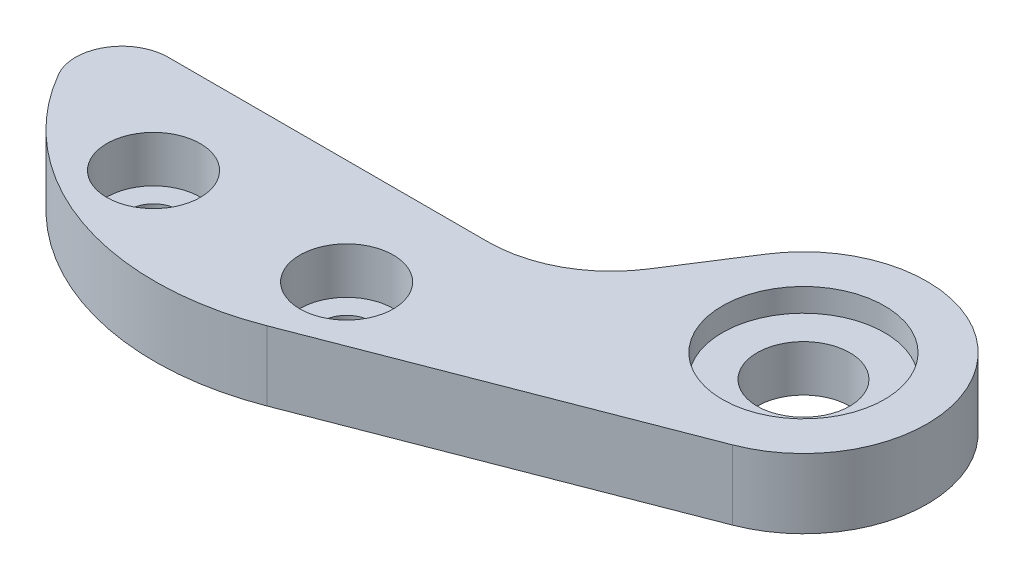
ISO-10303-21;
HEADER;
FILE_DESCRIPTION(('STEP AP214'),'2;1');
FILE_NAME('part.step','',(''),(''),'','','');
FILE_SCHEMA(('AUTOMOTIVE_DESIGN { 1 0 10303 214 1 1 1 1 }'));
ENDSEC;
DATA;
#1=APPLICATION_CONTEXT('core data for automotive mechanical design processes');
#2=APPLICATION_PROTOCOL_DEFINITION('international standard','automotive_design',2000,#1);
#3=PRODUCT_CONTEXT('',#1,'mechanical');
#4=PRODUCT('Part','Part','',(#3));
#5=PRODUCT_RELATED_PRODUCT_CATEGORY('part','',(#4));
#6=PRODUCT_DEFINITION_FORMATION('','',#4);
#7=PRODUCT_DEFINITION_CONTEXT('part definition',#1,'design');
#8=PRODUCT_DEFINITION('design','',#6,#7);
#9=PRODUCT_DEFINITION_SHAPE('','',#8);
#10=(LENGTH_UNIT() NAMED_UNIT(*) SI_UNIT(.MILLI.,.METRE.));
#11=(NAMED_UNIT(*) PLANE_ANGLE_UNIT() SI_UNIT($,.RADIAN.));
#12=(NAMED_UNIT(*) SI_UNIT($,.STERADIAN.) SOLID_ANGLE_UNIT());
#13=UNCERTAINTY_MEASURE_WITH_UNIT(LENGTH_MEASURE(1.E-05),#10,'distance_accuracy_value','');
#14=(GEOMETRIC_REPRESENTATION_CONTEXT(3) GLOBAL_UNCERTAINTY_ASSIGNED_CONTEXT((#13)) GLOBAL_UNIT_ASSIGNED_CONTEXT((#10,
#11,#12)) REPRESENTATION_CONTEXT('',''));
#15=CARTESIAN_POINT('',(0.,0.,0.));
#16=DIRECTION('',(0.,0.,1.));
#17=DIRECTION('',(1.,0.,0.));
#18=AXIS2_PLACEMENT_3D('',#15,#16,#17);
#19=CARTESIAN_POINT('',(0.,4.5,0.));
#20=DIRECTION('',(0.,-1.,0.));
#21=DIRECTION('',(0.,0.,-1.));
#22=AXIS2_PLACEMENT_3D('',#19,#20,#21);
#23=CYLINDRICAL_SURFACE('',#22,17.);
#24=CARTESIAN_POINT('',(0.,0.,0.));
#25=DIRECTION('',(0.,-1.,0.));
#26=DIRECTION('',(0.,0.,-1.));
#27=AXIS2_PLACEMENT_3D('',#24,#25,#26);
#28=CIRCLE('',#27,17.);
#29=CARTESIAN_POINT('',(6.12,0.,15.8601891539792));
#30=VERTEX_POINT('',#29);
#31=CARTESIAN_POINT('',(-14.7224318643355,0.,8.5));
#32=VERTEX_POINT('',#31);
#33=EDGE_CURVE('E134',#30,#32,#28,.T.);
#34=ORIENTED_EDGE('',*,*,#33,.F.);
#35=DIRECTION('',(0.,-1.,0.));
#36=VECTOR('',#35,1.);
#37=CARTESIAN_POINT('',(6.12,4.5,15.8601891539792));
#38=LINE('',#37,#36);
#39=CARTESIAN_POINT('',(6.12,4.5,15.8601891539792));
#40=VERTEX_POINT('',#39);
#41=EDGE_CURVE('E117',#40,#30,#38,.T.);
#42=ORIENTED_EDGE('',*,*,#41,.F.);
#43=CARTESIAN_POINT('',(0.,4.5,0.));
#44=DIRECTION('',(0.,-1.,0.));
#45=DIRECTION('',(0.,0.,-1.));
#46=AXIS2_PLACEMENT_3D('',#43,#44,#45);
#47=CIRCLE('',#46,17.);
#48=CARTESIAN_POINT('',(-14.7224318643355,4.5,8.5));
#49=VERTEX_POINT('',#48);
#50=EDGE_CURVE('E112',#40,#49,#47,.T.);
#51=ORIENTED_EDGE('',*,*,#50,.T.);
#52=DIRECTION('',(0.,-1.,0.));
#53=VECTOR('',#52,1.);
#54=CARTESIAN_POINT('',(-14.7224318643355,4.5,8.5));
#55=LINE('',#54,#53);
#56=EDGE_CURVE('E94',#49,#32,#55,.T.);
#57=ORIENTED_EDGE('',*,*,#56,.T.);
#58=EDGE_LOOP('',(#34,#42,#51,#57));
#59=FACE_BOUND('',#58,.T.);
#60=ADVANCED_FACE('F37',(#59),#23,.T.);
#61=CARTESIAN_POINT('',(27.88,4.5,7.46361842540199));
#62=DIRECTION('',(0.359999999999999,0.,0.932952303175248));
#63=DIRECTION('',(0.932952303175248,0.,-0.359999999999999));
#64=AXIS2_PLACEMENT_3D('',#61,#62,#63);
#65=PLANE('',#64);
#66=DIRECTION('',(-0.932952303175248,0.,0.359999999999999));
#67=VECTOR('',#66,1.);
#68=CARTESIAN_POINT('',(27.88,0.,7.46361842540199));
#69=LINE('',#68,#67);
#70=CARTESIAN_POINT('',(27.88,0.,7.46361842540199));
#71=VERTEX_POINT('',#70);
#72=EDGE_CURVE('E118',#71,#30,#69,.T.);
#73=ORIENTED_EDGE('',*,*,#72,.F.);
#74=DIRECTION('',(0.,-1.,0.));
#75=VECTOR('',#74,1.);
#76=CARTESIAN_POINT('',(27.88,4.5,7.46361842540199));
#77=LINE('',#76,#75);
#78=CARTESIAN_POINT('',(27.88,4.5,7.46361842540199));
#79=VERTEX_POINT('',#78);
#80=EDGE_CURVE('E145',#79,#71,#77,.T.);
#81=ORIENTED_EDGE('',*,*,#80,.F.);
#82=DIRECTION('',(-0.932952303175248,0.,0.359999999999999));
#83=VECTOR('',#82,1.);
#84=CARTESIAN_POINT('',(27.88,4.5,7.46361842540199));
#85=LINE('',#84,#83);
#86=EDGE_CURVE('E105',#79,#40,#85,.T.);
#87=ORIENTED_EDGE('',*,*,#86,.T.);
#88=ORIENTED_EDGE('',*,*,#41,.T.);
#89=EDGE_LOOP('',(#73,#81,#87,#88));
#90=FACE_BOUND('',#89,.T.);
#91=ADVANCED_FACE('F163',(#90),#65,.T.);
#92=CARTESIAN_POINT('',(25.,4.5,0.));
#93=DIRECTION('',(0.,-1.,0.));
#94=DIRECTION('',(0.,0.,-1.));
#95=AXIS2_PLACEMENT_3D('',#92,#93,#94);
#96=CYLINDRICAL_SURFACE('',#95,8.00000000000001);
#97=CARTESIAN_POINT('',(25.,0.,0.));
#98=DIRECTION('',(0.,-1.,0.));
#99=DIRECTION('',(0.,0.,-1.));
#100=AXIS2_PLACEMENT_3D('',#97,#98,#99);
#101=CIRCLE('',#100,8.00000000000001);
#102=CARTESIAN_POINT('',(18.2638318794235,0.,-4.31555779144817));
#103=VERTEX_POINT('',#102);
#104=EDGE_CURVE('E121',#103,#71,#101,.T.);
#105=ORIENTED_EDGE('',*,*,#104,.F.);
#106=DIRECTION('',(0.,-1.,0.));
#107=VECTOR('',#106,1.);
#108=CARTESIAN_POINT('',(18.2638318794235,4.5,-4.31555779144817));
#109=LINE('',#108,#107);
#110=CARTESIAN_POINT('',(18.2638318794235,4.5,-4.31555779144817));
#111=VERTEX_POINT('',#110);
#112=EDGE_CURVE('E147',#111,#103,#109,.T.);
#113=ORIENTED_EDGE('',*,*,#112,.F.);
#114=CARTESIAN_POINT('',(25.,4.5,0.));
#115=DIRECTION('',(0.,-1.,0.));
#116=DIRECTION('',(0.,0.,-1.));
#117=AXIS2_PLACEMENT_3D('',#114,#115,#116);
#118=CIRCLE('',#117,8.00000000000001);
#119=EDGE_CURVE('E130',#111,#79,#118,.T.);
#120=ORIENTED_EDGE('',*,*,#119,.T.);
#121=ORIENTED_EDGE('',*,*,#80,.T.);
#122=EDGE_LOOP('',(#105,#113,#120,#121));
#123=FACE_BOUND('',#122,.T.);
#124=ADVANCED_FACE('F167',(#123),#96,.T.);
#125=CARTESIAN_POINT('',(12.9364306663359,4.5,4.));
#126=DIRECTION('',(-0.842021015072063,0.,-0.539444723931019));
#127=DIRECTION('',(-0.539444723931019,0.,0.842021015072063));
#128=AXIS2_PLACEMENT_3D('',#125,#126,#127);
#129=PLANE('',#128);
#130=DIRECTION('',(0.539444723931019,0.,-0.842021015072062));
#131=VECTOR('',#130,1.);
#132=CARTESIAN_POINT('',(12.9364306663359,0.,4.));
#133=LINE('',#132,#131);
#134=CARTESIAN_POINT('',(15.2968858978029,0.,0.315557791448156));
#135=VERTEX_POINT('',#134);
#136=EDGE_CURVE('E139',#135,#103,#133,.T.);
#137=ORIENTED_EDGE('',*,*,#136,.F.);
#138=DIRECTION('',(0.,-1.,0.));
#139=VECTOR('',#138,1.);
#140=CARTESIAN_POINT('',(15.2968858978029,4.5,0.315557791448155));
#141=LINE('',#140,#139);
#142=CARTESIAN_POINT('',(15.2968858978029,4.5,0.315557791448156));
#143=VERTEX_POINT('',#142);
#144=EDGE_CURVE('E52',#135,#143,#141,.F.);
#145=ORIENTED_EDGE('',*,*,#144,.T.);
#146=DIRECTION('',(0.539444723931019,0.,-0.842021015072062));
#147=VECTOR('',#146,1.);
#148=CARTESIAN_POINT('',(12.9364306663359,4.5,4.));
#149=LINE('',#148,#147);
#150=EDGE_CURVE('E128',#143,#111,#149,.T.);
#151=ORIENTED_EDGE('',*,*,#150,.T.);
#152=ORIENTED_EDGE('',*,*,#112,.T.);
#153=EDGE_LOOP('',(#137,#145,#151,#152));
#154=FACE_BOUND('',#153,.T.);
#155=ADVANCED_FACE('F168',(#154),#129,.T.);
#156=CARTESIAN_POINT('',(-12.1243556529821,4.5,4.));
#157=DIRECTION('',(0.,0.,-1.));
#158=DIRECTION('',(-1.,0.,0.));
#159=AXIS2_PLACEMENT_3D('',#156,#157,#158);
#160=PLANE('',#159);
#161=DIRECTION('',(1.,0.,0.));
#162=VECTOR('',#161,1.);
#163=CARTESIAN_POINT('',(-12.1243556529821,4.5,4.));
#164=LINE('',#163,#162);
#165=CARTESIAN_POINT('',(-12.1243556529821,4.5,4.));
#166=VERTEX_POINT('',#165);
#167=CARTESIAN_POINT('',(8.56071777722641,4.5,4.));
#168=VERTEX_POINT('',#167);
#169=EDGE_CURVE('E115',#166,#168,#164,.T.);
#170=ORIENTED_EDGE('',*,*,#169,.T.);
#171=DIRECTION('',(0.,-1.,0.));
#172=VECTOR('',#171,1.);
#173=CARTESIAN_POINT('',(8.56071777722641,0.,4.));
#174=LINE('',#173,#172);
#175=CARTESIAN_POINT('',(8.56071777722641,0.,4.));
#176=VERTEX_POINT('',#175);
#177=EDGE_CURVE('E144',#168,#176,#174,.T.);
#178=ORIENTED_EDGE('',*,*,#177,.T.);
#179=DIRECTION('',(1.,0.,0.));
#180=VECTOR('',#179,1.);
#181=CARTESIAN_POINT('',(-12.1243556529821,0.,4.));
#182=LINE('',#181,#180);
#183=CARTESIAN_POINT('',(-12.1243556529821,0.,4.));
#184=VERTEX_POINT('',#183);
#185=EDGE_CURVE('E137',#184,#176,#182,.T.);
#186=ORIENTED_EDGE('',*,*,#185,.F.);
#187=DIRECTION('',(0.,-1.,0.));
#188=VECTOR('',#187,1.);
#189=CARTESIAN_POINT('',(-12.1243556529821,4.5,4.));
#190=LINE('',#189,#188);
#191=EDGE_CURVE('E104',#166,#184,#190,.T.);
#192=ORIENTED_EDGE('',*,*,#191,.F.);
#193=EDGE_LOOP('',(#170,#178,#186,#192));
#194=FACE_BOUND('',#193,.T.);
#195=ADVANCED_FACE('F156',(#194),#160,.T.);
#196=CARTESIAN_POINT('',(-12.1243556529821,4.5,7.));
#197=DIRECTION('',(0.,-1.,0.));
#198=DIRECTION('',(0.,0.,-1.));
#199=AXIS2_PLACEMENT_3D('',#196,#197,#198);
#200=CYLINDRICAL_SURFACE('',#199,3.);
#201=CARTESIAN_POINT('',(-12.1243556529821,0.,7.));
#202=DIRECTION('',(0.,-1.,0.));
#203=DIRECTION('',(0.,0.,-1.));
#204=AXIS2_PLACEMENT_3D('',#201,#202,#203);
#205=CIRCLE('',#204,3.);
#206=EDGE_CURVE('E99',#32,#184,#205,.T.);
#207=ORIENTED_EDGE('',*,*,#206,.F.);
#208=ORIENTED_EDGE('',*,*,#56,.F.);
#209=CARTESIAN_POINT('',(-12.1243556529821,4.5,7.));
#210=DIRECTION('',(0.,-1.,0.));
#211=DIRECTION('',(0.,0.,-1.));
#212=AXIS2_PLACEMENT_3D('',#209,#210,#211);
#213=CIRCLE('',#212,3.);
#214=EDGE_CURVE('E97',#49,#166,#213,.T.);
#215=ORIENTED_EDGE('',*,*,#214,.T.);
#216=ORIENTED_EDGE('',*,*,#191,.T.);
#217=EDGE_LOOP('',(#207,#208,#215,#216));
#218=FACE_BOUND('',#217,.T.);
#219=ADVANCED_FACE('F96',(#218),#200,.T.);
#220=CARTESIAN_POINT('',(0.,4.5,0.));
#221=DIRECTION('',(0.,-1.,0.));
#222=DIRECTION('',(0.,0.,-1.));
#223=AXIS2_PLACEMENT_3D('',#220,#221,#222);
#224=PLANE('',#223);
#225=CARTESIAN_POINT('',(25.,4.5,0.));
#226=DIRECTION('',(0.,1.,0.));
#227=DIRECTION('',(0.,0.,1.));
#228=AXIS2_PLACEMENT_3D('',#225,#226,#227);
#229=CIRCLE('',#228,5.25000000000001);
#230=CARTESIAN_POINT('',(25.,4.5,5.25000000000001));
#231=VERTEX_POINT('',#230);
#232=EDGE_CURVE('E236',#231,#231,#229,.T.);
#233=ORIENTED_EDGE('',*,*,#232,.F.);
#234=EDGE_LOOP('',(#233));
#235=FACE_BOUND('',#234,.T.);
#236=CARTESIAN_POINT('',(-6.25,4.5,10.8253175473055));
#237=DIRECTION('',(0.,1.,0.));
#238=DIRECTION('',(0.,0.,1.));
#239=AXIS2_PLACEMENT_3D('',#236,#237,#238);
#240=CIRCLE('',#239,3.025);
#241=CARTESIAN_POINT('',(-6.25,4.5,13.8503175473055));
#242=VERTEX_POINT('',#241);
#243=EDGE_CURVE('E245',#242,#242,#240,.T.);
#244=ORIENTED_EDGE('',*,*,#243,.F.);
#245=EDGE_LOOP('',(#244));
#246=FACE_BOUND('',#245,.T.);
#247=CARTESIAN_POINT('',(6.25,4.5,10.8253175473055));
#248=DIRECTION('',(0.,1.,0.));
#249=DIRECTION('',(0.,0.,1.));
#250=AXIS2_PLACEMENT_3D('',#247,#248,#249);
#251=CIRCLE('',#250,3.025);
#252=CARTESIAN_POINT('',(6.25,4.5,13.8503175473055));
#253=VERTEX_POINT('',#252);
#254=EDGE_CURVE('E257',#253,#253,#251,.T.);
#255=ORIENTED_EDGE('',*,*,#254,.F.);
#256=EDGE_LOOP('',(#255));
#257=FACE_BOUND('',#256,.T.);
#258=ORIENTED_EDGE('',*,*,#50,.F.);
#259=ORIENTED_EDGE('',*,*,#86,.F.);
#260=ORIENTED_EDGE('',*,*,#119,.F.);
#261=ORIENTED_EDGE('',*,*,#150,.F.);
#262=CARTESIAN_POINT('',(8.56071777722641,4.5,-4.));
#263=DIRECTION('',(0.,-1.,0.));
#264=DIRECTION('',(0.,0.,-1.));
#265=AXIS2_PLACEMENT_3D('',#262,#263,#264);
#266=CIRCLE('',#265,8.);
#267=EDGE_CURVE('E11',#143,#168,#266,.T.);
#268=ORIENTED_EDGE('',*,*,#267,.T.);
#269=ORIENTED_EDGE('',*,*,#169,.F.);
#270=ORIENTED_EDGE('',*,*,#214,.F.);
#271=EDGE_LOOP('',(#258,#259,#260,#261,#268,#269,#270));
#272=FACE_BOUND('',#271,.T.);
#273=ADVANCED_FACE('F110',(#235,#246,#257,#272),#224,.F.);
#274=CARTESIAN_POINT('',(0.,0.,0.));
#275=DIRECTION('',(0.,-1.,0.));
#276=DIRECTION('',(0.,0.,-1.));
#277=AXIS2_PLACEMENT_3D('',#274,#275,#276);
#278=PLANE('',#277);
#279=CARTESIAN_POINT('',(25.,0.,0.));
#280=DIRECTION('',(0.,1.,0.));
#281=DIRECTION('',(0.,0.,1.));
#282=AXIS2_PLACEMENT_3D('',#279,#280,#281);
#283=CIRCLE('',#282,3.00000000000001);
#284=CARTESIAN_POINT('',(25.,0.,3.00000000000001));
#285=VERTEX_POINT('',#284);
#286=EDGE_CURVE('E238',#285,#285,#283,.T.);
#287=ORIENTED_EDGE('',*,*,#286,.T.);
#288=EDGE_LOOP('',(#287));
#289=FACE_BOUND('',#288,.T.);
#290=CARTESIAN_POINT('',(-6.25,0.,10.8253175473055));
#291=DIRECTION('',(0.,1.,0.));
#292=DIRECTION('',(0.,0.,1.));
#293=AXIS2_PLACEMENT_3D('',#290,#291,#292);
#294=CIRCLE('',#293,1.60000000000001);
#295=CARTESIAN_POINT('',(-6.25,0.,12.4253175473055));
#296=VERTEX_POINT('',#295);
#297=EDGE_CURVE('E254',#296,#296,#294,.T.);
#298=ORIENTED_EDGE('',*,*,#297,.T.);
#299=EDGE_LOOP('',(#298));
#300=FACE_BOUND('',#299,.T.);
#301=CARTESIAN_POINT('',(6.25,0.,10.8253175473055));
#302=DIRECTION('',(0.,1.,0.));
#303=DIRECTION('',(0.,0.,1.));
#304=AXIS2_PLACEMENT_3D('',#301,#302,#303);
#305=CIRCLE('',#304,1.60000000000001);
#306=CARTESIAN_POINT('',(6.25,0.,12.4253175473055));
#307=VERTEX_POINT('',#306);
#308=EDGE_CURVE('E124',#307,#307,#305,.T.);
#309=ORIENTED_EDGE('',*,*,#308,.T.);
#310=EDGE_LOOP('',(#309));
#311=FACE_BOUND('',#310,.T.);
#312=ORIENTED_EDGE('',*,*,#33,.T.);
#313=ORIENTED_EDGE('',*,*,#206,.T.);
#314=ORIENTED_EDGE('',*,*,#185,.T.);
#315=CARTESIAN_POINT('',(8.56071777722641,0.,-4.));
#316=DIRECTION('',(0.,-1.,0.));
#317=DIRECTION('',(0.,0.,-1.));
#318=AXIS2_PLACEMENT_3D('',#315,#316,#317);
#319=CIRCLE('',#318,8.);
#320=EDGE_CURVE('E45',#176,#135,#319,.F.);
#321=ORIENTED_EDGE('',*,*,#320,.T.);
#322=ORIENTED_EDGE('',*,*,#136,.T.);
#323=ORIENTED_EDGE('',*,*,#104,.T.);
#324=ORIENTED_EDGE('',*,*,#72,.T.);
#325=EDGE_LOOP('',(#312,#313,#314,#321,#322,#323,#324));
#326=FACE_BOUND('',#325,.T.);
#327=ADVANCED_FACE('F159',(#289,#300,#311,#326),#278,.T.);
#328=CARTESIAN_POINT('',(6.25,4.5,10.8253175473055));
#329=DIRECTION('',(0.,1.,0.));
#330=DIRECTION('',(0.,0.,1.));
#331=AXIS2_PLACEMENT_3D('',#328,#329,#330);
#332=CYLINDRICAL_SURFACE('',#331,1.60000000000001);
#333=ORIENTED_EDGE('',*,*,#308,.F.);
#334=EDGE_LOOP('',(#333));
#335=FACE_BOUND('',#334,.T.);
#336=CARTESIAN_POINT('',(6.25,1.5,10.8253175473055));
#337=DIRECTION('',(0.,1.,0.));
#338=DIRECTION('',(0.,0.,1.));
#339=AXIS2_PLACEMENT_3D('',#336,#337,#338);
#340=CIRCLE('',#339,1.60000000000001);
#341=CARTESIAN_POINT('',(6.25,1.5,12.4253175473055));
#342=VERTEX_POINT('',#341);
#343=EDGE_CURVE('E262',#342,#342,#340,.T.);
#344=ORIENTED_EDGE('',*,*,#343,.T.);
#345=EDGE_LOOP('',(#344));
#346=FACE_BOUND('',#345,.T.);
#347=ADVANCED_FACE('F193',(#335,#346),#332,.F.);
#348=CARTESIAN_POINT('',(7.85000000000001,1.5,10.8253175473055));
#349=DIRECTION('',(0.,-1.,0.));
#350=DIRECTION('',(0.,0.,-1.));
#351=AXIS2_PLACEMENT_3D('',#348,#349,#350);
#352=PLANE('',#351);
#353=ORIENTED_EDGE('',*,*,#343,.F.);
#354=EDGE_LOOP('',(#353));
#355=FACE_BOUND('',#354,.T.);
#356=CARTESIAN_POINT('',(6.25,1.5,10.8253175473055));
#357=DIRECTION('',(0.,1.,0.));
#358=DIRECTION('',(0.,0.,1.));
#359=AXIS2_PLACEMENT_3D('',#356,#357,#358);
#360=CIRCLE('',#359,3.025);
#361=CARTESIAN_POINT('',(6.25,1.5,13.8503175473055));
#362=VERTEX_POINT('',#361);
#363=EDGE_CURVE('E260',#362,#362,#360,.T.);
#364=ORIENTED_EDGE('',*,*,#363,.T.);
#365=EDGE_LOOP('',(#364));
#366=FACE_BOUND('',#365,.T.);
#367=ADVANCED_FACE('F200',(#355,#366),#352,.F.);
#368=CARTESIAN_POINT('',(6.25,4.5,10.8253175473055));
#369=DIRECTION('',(0.,1.,0.));
#370=DIRECTION('',(0.,0.,1.));
#371=AXIS2_PLACEMENT_3D('',#368,#369,#370);
#372=CYLINDRICAL_SURFACE('',#371,3.025);
#373=ORIENTED_EDGE('',*,*,#363,.F.);
#374=EDGE_LOOP('',(#373));
#375=FACE_BOUND('',#374,.T.);
#376=ORIENTED_EDGE('',*,*,#254,.T.);
#377=EDGE_LOOP('',(#376));
#378=FACE_BOUND('',#377,.T.);
#379=ADVANCED_FACE('F204',(#375,#378),#372,.F.);
#380=CARTESIAN_POINT('',(-6.25,4.5,10.8253175473055));
#381=DIRECTION('',(0.,1.,0.));
#382=DIRECTION('',(0.,0.,1.));
#383=AXIS2_PLACEMENT_3D('',#380,#381,#382);
#384=CYLINDRICAL_SURFACE('',#383,1.60000000000001);
#385=ORIENTED_EDGE('',*,*,#297,.F.);
#386=EDGE_LOOP('',(#385));
#387=FACE_BOUND('',#386,.T.);
#388=CARTESIAN_POINT('',(-6.25,1.5,10.8253175473055));
#389=DIRECTION('',(0.,1.,0.));
#390=DIRECTION('',(0.,0.,1.));
#391=AXIS2_PLACEMENT_3D('',#388,#389,#390);
#392=CIRCLE('',#391,1.60000000000001);
#393=CARTESIAN_POINT('',(-6.25,1.5,12.4253175473055));
#394=VERTEX_POINT('',#393);
#395=EDGE_CURVE('E251',#394,#394,#392,.T.);
#396=ORIENTED_EDGE('',*,*,#395,.T.);
#397=EDGE_LOOP('',(#396));
#398=FACE_BOUND('',#397,.T.);
#399=ADVANCED_FACE('F208',(#387,#398),#384,.F.);
#400=CARTESIAN_POINT('',(-4.64999999999999,1.5,10.8253175473055));
#401=DIRECTION('',(0.,-1.,0.));
#402=DIRECTION('',(0.,0.,-1.));
#403=AXIS2_PLACEMENT_3D('',#400,#401,#402);
#404=PLANE('',#403);
#405=ORIENTED_EDGE('',*,*,#395,.F.);
#406=EDGE_LOOP('',(#405));
#407=FACE_BOUND('',#406,.T.);
#408=CARTESIAN_POINT('',(-6.25,1.5,10.8253175473055));
#409=DIRECTION('',(0.,1.,0.));
#410=DIRECTION('',(0.,0.,1.));
#411=AXIS2_PLACEMENT_3D('',#408,#409,#410);
#412=CIRCLE('',#411,3.025);
#413=CARTESIAN_POINT('',(-6.25,1.5,13.8503175473055));
#414=VERTEX_POINT('',#413);
#415=EDGE_CURVE('E248',#414,#414,#412,.T.);
#416=ORIENTED_EDGE('',*,*,#415,.T.);
#417=EDGE_LOOP('',(#416));
#418=FACE_BOUND('',#417,.T.);
#419=ADVANCED_FACE('F212',(#407,#418),#404,.F.);
#420=CARTESIAN_POINT('',(-6.25,4.5,10.8253175473055));
#421=DIRECTION('',(0.,1.,0.));
#422=DIRECTION('',(0.,0.,1.));
#423=AXIS2_PLACEMENT_3D('',#420,#421,#422);
#424=CYLINDRICAL_SURFACE('',#423,3.025);
#425=ORIENTED_EDGE('',*,*,#415,.F.);
#426=EDGE_LOOP('',(#425));
#427=FACE_BOUND('',#426,.T.);
#428=ORIENTED_EDGE('',*,*,#243,.T.);
#429=EDGE_LOOP('',(#428));
#430=FACE_BOUND('',#429,.T.);
#431=ADVANCED_FACE('F216',(#427,#430),#424,.F.);
#432=CARTESIAN_POINT('',(25.,4.5,0.));
#433=DIRECTION('',(0.,1.,0.));
#434=DIRECTION('',(0.,0.,1.));
#435=AXIS2_PLACEMENT_3D('',#432,#433,#434);
#436=CYLINDRICAL_SURFACE('',#435,3.00000000000001);
#437=ORIENTED_EDGE('',*,*,#286,.F.);
#438=EDGE_LOOP('',(#437));
#439=FACE_BOUND('',#438,.T.);
#440=CARTESIAN_POINT('',(25.,3.,0.));
#441=DIRECTION('',(0.,1.,0.));
#442=DIRECTION('',(0.,0.,1.));
#443=AXIS2_PLACEMENT_3D('',#440,#441,#442);
#444=CIRCLE('',#443,3.00000000000001);
#445=CARTESIAN_POINT('',(25.,3.,3.00000000000001));
#446=VERTEX_POINT('',#445);
#447=EDGE_CURVE('E232',#446,#446,#444,.T.);
#448=ORIENTED_EDGE('',*,*,#447,.T.);
#449=EDGE_LOOP('',(#448));
#450=FACE_BOUND('',#449,.T.);
#451=ADVANCED_FACE('F220',(#439,#450),#436,.F.);
#452=CARTESIAN_POINT('',(28.,3.,0.));
#453=DIRECTION('',(0.,-1.,0.));
#454=DIRECTION('',(0.,0.,-1.));
#455=AXIS2_PLACEMENT_3D('',#452,#453,#454);
#456=PLANE('',#455);
#457=ORIENTED_EDGE('',*,*,#447,.F.);
#458=EDGE_LOOP('',(#457));
#459=FACE_BOUND('',#458,.T.);
#460=CARTESIAN_POINT('',(25.,3.,0.));
#461=DIRECTION('',(0.,1.,0.));
#462=DIRECTION('',(0.,0.,1.));
#463=AXIS2_PLACEMENT_3D('',#460,#461,#462);
#464=CIRCLE('',#463,5.25000000000001);
#465=CARTESIAN_POINT('',(25.,3.,5.25000000000001));
#466=VERTEX_POINT('',#465);
#467=EDGE_CURVE('E235',#466,#466,#464,.T.);
#468=ORIENTED_EDGE('',*,*,#467,.T.);
#469=EDGE_LOOP('',(#468));
#470=FACE_BOUND('',#469,.T.);
#471=ADVANCED_FACE('F174',(#459,#470),#456,.F.);
#472=CARTESIAN_POINT('',(25.,4.5,0.));
#473=DIRECTION('',(0.,1.,0.));
#474=DIRECTION('',(0.,0.,1.));
#475=AXIS2_PLACEMENT_3D('',#472,#473,#474);
#476=CYLINDRICAL_SURFACE('',#475,5.25000000000001);
#477=ORIENTED_EDGE('',*,*,#467,.F.);
#478=EDGE_LOOP('',(#477));
#479=FACE_BOUND('',#478,.T.);
#480=ORIENTED_EDGE('',*,*,#232,.T.);
#481=EDGE_LOOP('',(#480));
#482=FACE_BOUND('',#481,.T.);
#483=ADVANCED_FACE('F170',(#479,#482),#476,.F.);
#484=CARTESIAN_POINT('',(8.56071777722641,4.5,-4.));
#485=DIRECTION('',(0.,1.,0.));
#486=DIRECTION('',(0.,0.,1.));
#487=AXIS2_PLACEMENT_3D('',#484,#485,#486);
#488=CYLINDRICAL_SURFACE('',#487,8.);
#489=ORIENTED_EDGE('',*,*,#267,.F.);
#490=ORIENTED_EDGE('',*,*,#144,.F.);
#491=ORIENTED_EDGE('',*,*,#320,.F.);
#492=ORIENTED_EDGE('',*,*,#177,.F.);
#493=EDGE_LOOP('',(#489,#490,#491,#492));
#494=FACE_BOUND('',#493,.T.);
#495=ADVANCED_FACE('F39',(#494),#488,.F.);
#496=CLOSED_SHELL('',(#60,#91,#124,#155,#195,#219,#273,#327,#347,#367,#379,#399,#419,#431,#451,
#471,#483,#495));
#497=MANIFOLD_SOLID_BREP('B2',#496);
#498=ADVANCED_BREP_SHAPE_REPRESENTATION('',(#18,#497),#14);
#499=SHAPE_DEFINITION_REPRESENTATION(#9,#498);
ENDSEC;
END-ISO-10303-21;
